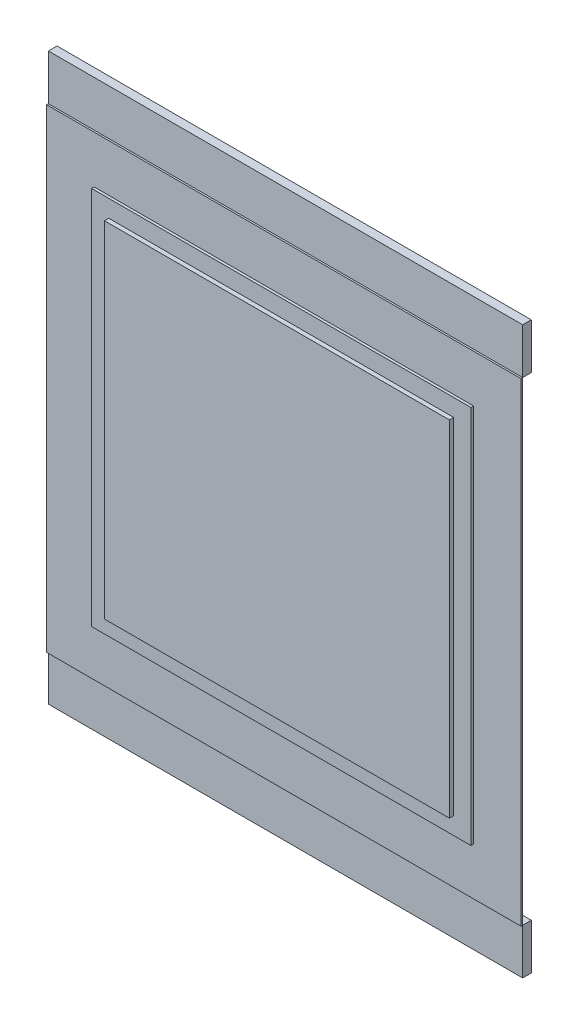
ISO-10303-21;
HEADER;
FILE_DESCRIPTION(('STEP AP214'),'2;1');
FILE_NAME('part.step','',(''),(''),'','','');
FILE_SCHEMA(('AUTOMOTIVE_DESIGN { 1 0 10303 214 1 1 1 1 }'));
ENDSEC;
DATA;
#1=APPLICATION_CONTEXT('core data for automotive mechanical design processes');
#2=APPLICATION_PROTOCOL_DEFINITION('international standard','automotive_design',2000,#1);
#3=PRODUCT_CONTEXT('',#1,'mechanical');
#4=PRODUCT('Part','Part','',(#3));
#5=PRODUCT_RELATED_PRODUCT_CATEGORY('part','',(#4));
#6=PRODUCT_DEFINITION_FORMATION('','',#4);
#7=PRODUCT_DEFINITION_CONTEXT('part definition',#1,'design');
#8=PRODUCT_DEFINITION('design','',#6,#7);
#9=PRODUCT_DEFINITION_SHAPE('','',#8);
#10=(LENGTH_UNIT() NAMED_UNIT(*) SI_UNIT(.MILLI.,.METRE.));
#11=(NAMED_UNIT(*) PLANE_ANGLE_UNIT() SI_UNIT($,.RADIAN.));
#12=(NAMED_UNIT(*) SI_UNIT($,.STERADIAN.) SOLID_ANGLE_UNIT());
#13=UNCERTAINTY_MEASURE_WITH_UNIT(LENGTH_MEASURE(1.E-05),#10,'distance_accuracy_value','');
#14=(GEOMETRIC_REPRESENTATION_CONTEXT(3) GLOBAL_UNCERTAINTY_ASSIGNED_CONTEXT((#13)) GLOBAL_UNIT_ASSIGNED_CONTEXT((#10,
#11,#12)) REPRESENTATION_CONTEXT('',''));
#15=CARTESIAN_POINT('',(0.,0.,0.));
#16=DIRECTION('',(0.,0.,1.));
#17=DIRECTION('',(1.,0.,0.));
#18=AXIS2_PLACEMENT_3D('',#15,#16,#17);
#19=CARTESIAN_POINT('',(-275.,275.,-10.));
#20=DIRECTION('',(1.,0.,0.));
#21=DIRECTION('',(0.,0.,-1.));
#22=AXIS2_PLACEMENT_3D('',#19,#20,#21);
#23=PLANE('',#22);
#24=DIRECTION('',(0.,1.,0.));
#25=VECTOR('',#24,1.);
#26=CARTESIAN_POINT('',(-275.,275.,0.));
#27=LINE('',#26,#25);
#28=CARTESIAN_POINT('',(-275.,275.,0.));
#29=VERTEX_POINT('',#28);
#30=CARTESIAN_POINT('',(-275.,328.,0.));
#31=VERTEX_POINT('',#30);
#32=EDGE_CURVE('E12',#29,#31,#27,.T.);
#33=ORIENTED_EDGE('',*,*,#32,.T.);
#34=DIRECTION('',(0.,0.,1.));
#35=VECTOR('',#34,1.);
#36=CARTESIAN_POINT('',(-275.,328.,-10.));
#37=LINE('',#36,#35);
#38=CARTESIAN_POINT('',(-275.,328.,-10.));
#39=VERTEX_POINT('',#38);
#40=EDGE_CURVE('E121',#39,#31,#37,.T.);
#41=ORIENTED_EDGE('',*,*,#40,.F.);
#42=DIRECTION('',(0.,1.,0.));
#43=VECTOR('',#42,1.);
#44=CARTESIAN_POINT('',(-275.,275.,-10.));
#45=LINE('',#44,#43);
#46=CARTESIAN_POINT('',(-275.,275.,-10.));
#47=VERTEX_POINT('',#46);
#48=EDGE_CURVE('E53',#47,#39,#45,.T.);
#49=ORIENTED_EDGE('',*,*,#48,.F.);
#50=DIRECTION('',(0.,0.,1.));
#51=VECTOR('',#50,1.);
#52=CARTESIAN_POINT('',(-275.,275.,-10.));
#53=LINE('',#52,#51);
#54=EDGE_CURVE('E108',#47,#29,#53,.T.);
#55=ORIENTED_EDGE('',*,*,#54,.T.);
#56=EDGE_LOOP('',(#33,#41,#49,#55));
#57=FACE_BOUND('',#56,.T.);
#58=ADVANCED_FACE('F49',(#57),#23,.F.);
#59=CARTESIAN_POINT('',(-275.,328.,-10.));
#60=DIRECTION('',(0.,-1.,0.));
#61=DIRECTION('',(0.,0.,-1.));
#62=AXIS2_PLACEMENT_3D('',#59,#60,#61);
#63=PLANE('',#62);
#64=DIRECTION('',(1.,0.,0.));
#65=VECTOR('',#64,1.);
#66=CARTESIAN_POINT('',(-275.,328.,0.));
#67=LINE('',#66,#65);
#68=CARTESIAN_POINT('',(275.,328.,0.));
#69=VERTEX_POINT('',#68);
#70=EDGE_CURVE('E58',#31,#69,#67,.T.);
#71=ORIENTED_EDGE('',*,*,#70,.T.);
#72=DIRECTION('',(0.,0.,1.));
#73=VECTOR('',#72,1.);
#74=CARTESIAN_POINT('',(275.,328.,-10.));
#75=LINE('',#74,#73);
#76=CARTESIAN_POINT('',(275.,328.,-10.));
#77=VERTEX_POINT('',#76);
#78=EDGE_CURVE('E104',#77,#69,#75,.T.);
#79=ORIENTED_EDGE('',*,*,#78,.F.);
#80=DIRECTION('',(1.,0.,0.));
#81=VECTOR('',#80,1.);
#82=CARTESIAN_POINT('',(-275.,328.,-10.));
#83=LINE('',#82,#81);
#84=EDGE_CURVE('E83',#39,#77,#83,.T.);
#85=ORIENTED_EDGE('',*,*,#84,.F.);
#86=ORIENTED_EDGE('',*,*,#40,.T.);
#87=EDGE_LOOP('',(#71,#79,#85,#86));
#88=FACE_BOUND('',#87,.T.);
#89=ADVANCED_FACE('F123',(#88),#63,.F.);
#90=CARTESIAN_POINT('',(275.,275.,-10.));
#91=DIRECTION('',(-1.,0.,0.));
#92=DIRECTION('',(0.,0.,1.));
#93=AXIS2_PLACEMENT_3D('',#90,#91,#92);
#94=PLANE('',#93);
#95=DIRECTION('',(0.,-1.,0.));
#96=VECTOR('',#95,1.);
#97=CARTESIAN_POINT('',(275.,275.,0.));
#98=LINE('',#97,#96);
#99=CARTESIAN_POINT('',(275.,275.,0.));
#100=VERTEX_POINT('',#99);
#101=EDGE_CURVE('E99',#69,#100,#98,.T.);
#102=ORIENTED_EDGE('',*,*,#101,.T.);
#103=DIRECTION('',(0.,0.,1.));
#104=VECTOR('',#103,1.);
#105=CARTESIAN_POINT('',(275.,275.,-10.));
#106=LINE('',#105,#104);
#107=CARTESIAN_POINT('',(275.,275.,-10.));
#108=VERTEX_POINT('',#107);
#109=EDGE_CURVE('E103',#108,#100,#106,.T.);
#110=ORIENTED_EDGE('',*,*,#109,.F.);
#111=DIRECTION('',(0.,-1.,0.));
#112=VECTOR('',#111,1.);
#113=CARTESIAN_POINT('',(275.,275.,-10.));
#114=LINE('',#113,#112);
#115=EDGE_CURVE('E120',#77,#108,#114,.T.);
#116=ORIENTED_EDGE('',*,*,#115,.F.);
#117=ORIENTED_EDGE('',*,*,#78,.T.);
#118=EDGE_LOOP('',(#102,#110,#116,#117));
#119=FACE_BOUND('',#118,.T.);
#120=ADVANCED_FACE('F101',(#119),#94,.F.);
#121=CARTESIAN_POINT('',(-275.,275.,-10.));
#122=DIRECTION('',(0.,1.,0.));
#123=DIRECTION('',(0.,0.,1.));
#124=AXIS2_PLACEMENT_3D('',#121,#122,#123);
#125=PLANE('',#124);
#126=DIRECTION('',(-1.,0.,0.));
#127=VECTOR('',#126,1.);
#128=CARTESIAN_POINT('',(-275.,275.,0.));
#129=LINE('',#128,#127);
#130=EDGE_CURVE('E94',#100,#29,#129,.T.);
#131=ORIENTED_EDGE('',*,*,#130,.T.);
#132=ORIENTED_EDGE('',*,*,#54,.F.);
#133=DIRECTION('',(-1.,0.,0.));
#134=VECTOR('',#133,1.);
#135=CARTESIAN_POINT('',(-275.,275.,-10.));
#136=LINE('',#135,#134);
#137=EDGE_CURVE('E107',#108,#47,#136,.T.);
#138=ORIENTED_EDGE('',*,*,#137,.F.);
#139=ORIENTED_EDGE('',*,*,#109,.T.);
#140=EDGE_LOOP('',(#131,#132,#138,#139));
#141=FACE_BOUND('',#140,.T.);
#142=ADVANCED_FACE('F110',(#141),#125,.F.);
#143=CARTESIAN_POINT('',(0.,0.,-10.));
#144=DIRECTION('',(0.,0.,-1.));
#145=DIRECTION('',(-1.,0.,0.));
#146=AXIS2_PLACEMENT_3D('',#143,#144,#145);
#147=PLANE('',#146);
#148=ORIENTED_EDGE('',*,*,#48,.T.);
#149=ORIENTED_EDGE('',*,*,#84,.T.);
#150=ORIENTED_EDGE('',*,*,#115,.T.);
#151=ORIENTED_EDGE('',*,*,#137,.T.);
#152=EDGE_LOOP('',(#148,#149,#150,#151));
#153=FACE_BOUND('',#152,.T.);
#154=ADVANCED_FACE('F55',(#153),#147,.T.);
#155=CARTESIAN_POINT('',(0.,0.,0.));
#156=DIRECTION('',(0.,0.,-1.));
#157=DIRECTION('',(-1.,0.,0.));
#158=AXIS2_PLACEMENT_3D('',#155,#156,#157);
#159=PLANE('',#158);
#160=ORIENTED_EDGE('',*,*,#32,.F.);
#161=ORIENTED_EDGE('',*,*,#130,.F.);
#162=ORIENTED_EDGE('',*,*,#101,.F.);
#163=ORIENTED_EDGE('',*,*,#70,.F.);
#164=EDGE_LOOP('',(#160,#161,#162,#163));
#165=FACE_BOUND('',#164,.T.);
#166=ADVANCED_FACE('F112',(#165),#159,.F.);
#167=CLOSED_SHELL('',(#58,#89,#120,#142,#154,#166));
#168=MANIFOLD_SOLID_BREP('B2',#167);
#169=CARTESIAN_POINT('',(-275.,-275.,-10.));
#170=DIRECTION('',(1.,0.,0.));
#171=DIRECTION('',(0.,0.,-1.));
#172=AXIS2_PLACEMENT_3D('',#169,#170,#171);
#173=PLANE('',#172);
#174=DIRECTION('',(0.,1.,0.));
#175=VECTOR('',#174,1.);
#176=CARTESIAN_POINT('',(-275.,-275.,0.));
#177=LINE('',#176,#175);
#178=CARTESIAN_POINT('',(-275.,-328.,0.));
#179=VERTEX_POINT('',#178);
#180=CARTESIAN_POINT('',(-275.,-275.,0.));
#181=VERTEX_POINT('',#180);
#182=EDGE_CURVE('E246',#179,#181,#177,.T.);
#183=ORIENTED_EDGE('',*,*,#182,.T.);
#184=DIRECTION('',(0.,0.,1.));
#185=VECTOR('',#184,1.);
#186=CARTESIAN_POINT('',(-275.,-275.,-10.));
#187=LINE('',#186,#185);
#188=CARTESIAN_POINT('',(-275.,-275.,-10.));
#189=VERTEX_POINT('',#188);
#190=EDGE_CURVE('E48',#189,#181,#187,.T.);
#191=ORIENTED_EDGE('',*,*,#190,.F.);
#192=DIRECTION('',(0.,1.,0.));
#193=VECTOR('',#192,1.);
#194=CARTESIAN_POINT('',(-275.,-275.,-10.));
#195=LINE('',#194,#193);
#196=CARTESIAN_POINT('',(-275.,-328.,-10.));
#197=VERTEX_POINT('',#196);
#198=EDGE_CURVE('E233',#197,#189,#195,.T.);
#199=ORIENTED_EDGE('',*,*,#198,.F.);
#200=DIRECTION('',(0.,0.,1.));
#201=VECTOR('',#200,1.);
#202=CARTESIAN_POINT('',(-275.,-328.,-10.));
#203=LINE('',#202,#201);
#204=EDGE_CURVE('E245',#197,#179,#203,.T.);
#205=ORIENTED_EDGE('',*,*,#204,.T.);
#206=EDGE_LOOP('',(#183,#191,#199,#205));
#207=FACE_BOUND('',#206,.T.);
#208=ADVANCED_FACE('F181',(#207),#173,.F.);
#209=CARTESIAN_POINT('',(-275.,-275.,-10.));
#210=DIRECTION('',(0.,-1.,0.));
#211=DIRECTION('',(0.,0.,-1.));
#212=AXIS2_PLACEMENT_3D('',#209,#210,#211);
#213=PLANE('',#212);
#214=DIRECTION('',(1.,0.,0.));
#215=VECTOR('',#214,1.);
#216=CARTESIAN_POINT('',(-275.,-275.,0.));
#217=LINE('',#216,#215);
#218=CARTESIAN_POINT('',(275.,-275.,0.));
#219=VERTEX_POINT('',#218);
#220=EDGE_CURVE('E236',#181,#219,#217,.T.);
#221=ORIENTED_EDGE('',*,*,#220,.T.);
#222=DIRECTION('',(0.,0.,1.));
#223=VECTOR('',#222,1.);
#224=CARTESIAN_POINT('',(275.,-275.,-10.));
#225=LINE('',#224,#223);
#226=CARTESIAN_POINT('',(275.,-275.,-10.));
#227=VERTEX_POINT('',#226);
#228=EDGE_CURVE('E191',#227,#219,#225,.T.);
#229=ORIENTED_EDGE('',*,*,#228,.F.);
#230=DIRECTION('',(1.,0.,0.));
#231=VECTOR('',#230,1.);
#232=CARTESIAN_POINT('',(-275.,-275.,-10.));
#233=LINE('',#232,#231);
#234=EDGE_CURVE('E226',#189,#227,#233,.T.);
#235=ORIENTED_EDGE('',*,*,#234,.F.);
#236=ORIENTED_EDGE('',*,*,#190,.T.);
#237=EDGE_LOOP('',(#221,#229,#235,#236));
#238=FACE_BOUND('',#237,.T.);
#239=ADVANCED_FACE('F240',(#238),#213,.F.);
#240=CARTESIAN_POINT('',(275.,-275.,-10.));
#241=DIRECTION('',(-1.,0.,0.));
#242=DIRECTION('',(0.,0.,1.));
#243=AXIS2_PLACEMENT_3D('',#240,#241,#242);
#244=PLANE('',#243);
#245=DIRECTION('',(0.,-1.,0.));
#246=VECTOR('',#245,1.);
#247=CARTESIAN_POINT('',(275.,-275.,0.));
#248=LINE('',#247,#246);
#249=CARTESIAN_POINT('',(275.,-328.,0.));
#250=VERTEX_POINT('',#249);
#251=EDGE_CURVE('E216',#219,#250,#248,.T.);
#252=ORIENTED_EDGE('',*,*,#251,.T.);
#253=DIRECTION('',(0.,0.,1.));
#254=VECTOR('',#253,1.);
#255=CARTESIAN_POINT('',(275.,-328.,-10.));
#256=LINE('',#255,#254);
#257=CARTESIAN_POINT('',(275.,-328.,-10.));
#258=VERTEX_POINT('',#257);
#259=EDGE_CURVE('E239',#258,#250,#256,.T.);
#260=ORIENTED_EDGE('',*,*,#259,.F.);
#261=DIRECTION('',(0.,-1.,0.));
#262=VECTOR('',#261,1.);
#263=CARTESIAN_POINT('',(275.,-275.,-10.));
#264=LINE('',#263,#262);
#265=EDGE_CURVE('E232',#227,#258,#264,.T.);
#266=ORIENTED_EDGE('',*,*,#265,.F.);
#267=ORIENTED_EDGE('',*,*,#228,.T.);
#268=EDGE_LOOP('',(#252,#260,#266,#267));
#269=FACE_BOUND('',#268,.T.);
#270=ADVANCED_FACE('F238',(#269),#244,.F.);
#271=CARTESIAN_POINT('',(-275.,-328.,-10.));
#272=DIRECTION('',(0.,1.,0.));
#273=DIRECTION('',(0.,0.,1.));
#274=AXIS2_PLACEMENT_3D('',#271,#272,#273);
#275=PLANE('',#274);
#276=DIRECTION('',(-1.,0.,0.));
#277=VECTOR('',#276,1.);
#278=CARTESIAN_POINT('',(-275.,-328.,0.));
#279=LINE('',#278,#277);
#280=EDGE_CURVE('E225',#250,#179,#279,.T.);
#281=ORIENTED_EDGE('',*,*,#280,.T.);
#282=ORIENTED_EDGE('',*,*,#204,.F.);
#283=DIRECTION('',(-1.,0.,0.));
#284=VECTOR('',#283,1.);
#285=CARTESIAN_POINT('',(-275.,-328.,-10.));
#286=LINE('',#285,#284);
#287=EDGE_CURVE('E200',#258,#197,#286,.T.);
#288=ORIENTED_EDGE('',*,*,#287,.F.);
#289=ORIENTED_EDGE('',*,*,#259,.T.);
#290=EDGE_LOOP('',(#281,#282,#288,#289));
#291=FACE_BOUND('',#290,.T.);
#292=ADVANCED_FACE('F251',(#291),#275,.F.);
#293=CARTESIAN_POINT('',(0.,0.,-10.));
#294=DIRECTION('',(0.,0.,1.));
#295=DIRECTION('',(1.,0.,0.));
#296=AXIS2_PLACEMENT_3D('',#293,#294,#295);
#297=PLANE('',#296);
#298=ORIENTED_EDGE('',*,*,#198,.T.);
#299=ORIENTED_EDGE('',*,*,#234,.T.);
#300=ORIENTED_EDGE('',*,*,#265,.T.);
#301=ORIENTED_EDGE('',*,*,#287,.T.);
#302=EDGE_LOOP('',(#298,#299,#300,#301));
#303=FACE_BOUND('',#302,.T.);
#304=ADVANCED_FACE('F228',(#303),#297,.F.);
#305=CARTESIAN_POINT('',(0.,0.,0.));
#306=DIRECTION('',(0.,0.,1.));
#307=DIRECTION('',(1.,0.,0.));
#308=AXIS2_PLACEMENT_3D('',#305,#306,#307);
#309=PLANE('',#308);
#310=ORIENTED_EDGE('',*,*,#182,.F.);
#311=ORIENTED_EDGE('',*,*,#280,.F.);
#312=ORIENTED_EDGE('',*,*,#251,.F.);
#313=ORIENTED_EDGE('',*,*,#220,.F.);
#314=EDGE_LOOP('',(#310,#311,#312,#313));
#315=FACE_BOUND('',#314,.T.);
#316=ADVANCED_FACE('F258',(#315),#309,.T.);
#317=CLOSED_SHELL('',(#208,#239,#270,#292,#304,#316));
#318=MANIFOLD_SOLID_BREP('B6',#317);
#319=CARTESIAN_POINT('',(-220.,-220.,5.));
#320=DIRECTION('',(-1.,0.,0.));
#321=DIRECTION('',(0.,0.,1.));
#322=AXIS2_PLACEMENT_3D('',#319,#320,#321);
#323=PLANE('',#322);
#324=DIRECTION('',(0.,0.,-1.));
#325=VECTOR('',#324,1.);
#326=CARTESIAN_POINT('',(-220.,220.,5.));
#327=LINE('',#326,#325);
#328=CARTESIAN_POINT('',(-220.,220.,5.));
#329=VERTEX_POINT('',#328);
#330=CARTESIAN_POINT('',(-220.,220.,2.));
#331=VERTEX_POINT('',#330);
#332=EDGE_CURVE('E457',#329,#331,#327,.T.);
#333=ORIENTED_EDGE('',*,*,#332,.T.);
#334=DIRECTION('',(0.,-1.,0.));
#335=VECTOR('',#334,1.);
#336=CARTESIAN_POINT('',(-220.,-220.,2.));
#337=LINE('',#336,#335);
#338=CARTESIAN_POINT('',(-220.,-220.,2.));
#339=VERTEX_POINT('',#338);
#340=EDGE_CURVE('E325',#331,#339,#337,.T.);
#341=ORIENTED_EDGE('',*,*,#340,.T.);
#342=DIRECTION('',(0.,0.,-1.));
#343=VECTOR('',#342,1.);
#344=CARTESIAN_POINT('',(-220.,-220.,5.));
#345=LINE('',#344,#343);
#346=CARTESIAN_POINT('',(-220.,-220.,5.));
#347=VERTEX_POINT('',#346);
#348=EDGE_CURVE('E460',#347,#339,#345,.T.);
#349=ORIENTED_EDGE('',*,*,#348,.F.);
#350=DIRECTION('',(0.,1.,0.));
#351=VECTOR('',#350,1.);
#352=CARTESIAN_POINT('',(-220.,-220.,5.));
#353=LINE('',#352,#351);
#354=EDGE_CURVE('E441',#347,#329,#353,.T.);
#355=ORIENTED_EDGE('',*,*,#354,.T.);
#356=EDGE_LOOP('',(#333,#341,#349,#355));
#357=FACE_BOUND('',#356,.T.);
#358=ADVANCED_FACE('F307',(#357),#323,.T.);
#359=CARTESIAN_POINT('',(-220.,-220.,5.));
#360=DIRECTION('',(0.,-1.,0.));
#361=DIRECTION('',(0.,0.,-1.));
#362=AXIS2_PLACEMENT_3D('',#359,#360,#361);
#363=PLANE('',#362);
#364=ORIENTED_EDGE('',*,*,#348,.T.);
#365=DIRECTION('',(1.,0.,0.));
#366=VECTOR('',#365,1.);
#367=CARTESIAN_POINT('',(-220.,-220.,2.));
#368=LINE('',#367,#366);
#369=CARTESIAN_POINT('',(220.,-220.,2.));
#370=VERTEX_POINT('',#369);
#371=EDGE_CURVE('E439',#339,#370,#368,.T.);
#372=ORIENTED_EDGE('',*,*,#371,.T.);
#373=DIRECTION('',(0.,0.,-1.));
#374=VECTOR('',#373,1.);
#375=CARTESIAN_POINT('',(220.,-220.,5.));
#376=LINE('',#375,#374);
#377=CARTESIAN_POINT('',(220.,-220.,5.));
#378=VERTEX_POINT('',#377);
#379=EDGE_CURVE('E462',#378,#370,#376,.T.);
#380=ORIENTED_EDGE('',*,*,#379,.F.);
#381=DIRECTION('',(-1.,0.,0.));
#382=VECTOR('',#381,1.);
#383=CARTESIAN_POINT('',(-220.,-220.,5.));
#384=LINE('',#383,#382);
#385=EDGE_CURVE('E454',#378,#347,#384,.T.);
#386=ORIENTED_EDGE('',*,*,#385,.T.);
#387=EDGE_LOOP('',(#364,#372,#380,#386));
#388=FACE_BOUND('',#387,.T.);
#389=ADVANCED_FACE('F518',(#388),#363,.T.);
#390=CARTESIAN_POINT('',(220.,-220.,5.));
#391=DIRECTION('',(1.,0.,0.));
#392=DIRECTION('',(0.,0.,-1.));
#393=AXIS2_PLACEMENT_3D('',#390,#391,#392);
#394=PLANE('',#393);
#395=ORIENTED_EDGE('',*,*,#379,.T.);
#396=DIRECTION('',(0.,1.,0.));
#397=VECTOR('',#396,1.);
#398=CARTESIAN_POINT('',(220.,-220.,2.));
#399=LINE('',#398,#397);
#400=CARTESIAN_POINT('',(220.,220.,2.));
#401=VERTEX_POINT('',#400);
#402=EDGE_CURVE('E432',#370,#401,#399,.T.);
#403=ORIENTED_EDGE('',*,*,#402,.T.);
#404=DIRECTION('',(0.,0.,-1.));
#405=VECTOR('',#404,1.);
#406=CARTESIAN_POINT('',(220.,220.,5.));
#407=LINE('',#406,#405);
#408=CARTESIAN_POINT('',(220.,220.,5.));
#409=VERTEX_POINT('',#408);
#410=EDGE_CURVE('E461',#409,#401,#407,.T.);
#411=ORIENTED_EDGE('',*,*,#410,.F.);
#412=DIRECTION('',(0.,-1.,0.));
#413=VECTOR('',#412,1.);
#414=CARTESIAN_POINT('',(220.,-220.,5.));
#415=LINE('',#414,#413);
#416=EDGE_CURVE('E448',#409,#378,#415,.T.);
#417=ORIENTED_EDGE('',*,*,#416,.T.);
#418=EDGE_LOOP('',(#395,#403,#411,#417));
#419=FACE_BOUND('',#418,.T.);
#420=ADVANCED_FACE('F527',(#419),#394,.T.);
#421=CARTESIAN_POINT('',(-220.,220.,5.));
#422=DIRECTION('',(0.,1.,0.));
#423=DIRECTION('',(0.,0.,1.));
#424=AXIS2_PLACEMENT_3D('',#421,#422,#423);
#425=PLANE('',#424);
#426=ORIENTED_EDGE('',*,*,#410,.T.);
#427=DIRECTION('',(-1.,0.,0.));
#428=VECTOR('',#427,1.);
#429=CARTESIAN_POINT('',(-220.,220.,2.));
#430=LINE('',#429,#428);
#431=EDGE_CURVE('E182',#401,#331,#430,.T.);
#432=ORIENTED_EDGE('',*,*,#431,.T.);
#433=ORIENTED_EDGE('',*,*,#332,.F.);
#434=DIRECTION('',(1.,0.,0.));
#435=VECTOR('',#434,1.);
#436=CARTESIAN_POINT('',(-220.,220.,5.));
#437=LINE('',#436,#435);
#438=EDGE_CURVE('E450',#329,#409,#437,.T.);
#439=ORIENTED_EDGE('',*,*,#438,.T.);
#440=EDGE_LOOP('',(#426,#432,#433,#439));
#441=FACE_BOUND('',#440,.T.);
#442=ADVANCED_FACE('F519',(#441),#425,.T.);
#443=CARTESIAN_POINT('',(-200.,0.,10.));
#444=DIRECTION('',(1.,0.,0.));
#445=DIRECTION('',(0.,1.,0.));
#446=AXIS2_PLACEMENT_3D('',#443,#444,#445);
#447=PLANE('',#446);
#448=DIRECTION('',(0.,1.,0.));
#449=VECTOR('',#448,1.);
#450=CARTESIAN_POINT('',(-200.,0.,5.));
#451=LINE('',#450,#449);
#452=CARTESIAN_POINT('',(-200.,-200.,5.));
#453=VERTEX_POINT('',#452);
#454=CARTESIAN_POINT('',(-200.,200.,5.));
#455=VERTEX_POINT('',#454);
#456=EDGE_CURVE('E328',#453,#455,#451,.T.);
#457=ORIENTED_EDGE('',*,*,#456,.F.);
#458=DIRECTION('',(0.,0.,-1.));
#459=VECTOR('',#458,1.);
#460=CARTESIAN_POINT('',(-200.,-200.,10.));
#461=LINE('',#460,#459);
#462=CARTESIAN_POINT('',(-200.,-200.,10.));
#463=VERTEX_POINT('',#462);
#464=EDGE_CURVE('E493',#463,#453,#461,.T.);
#465=ORIENTED_EDGE('',*,*,#464,.F.);
#466=DIRECTION('',(0.,-1.,0.));
#467=VECTOR('',#466,1.);
#468=CARTESIAN_POINT('',(-200.,0.,10.));
#469=LINE('',#468,#467);
#470=CARTESIAN_POINT('',(-200.,200.,10.));
#471=VERTEX_POINT('',#470);
#472=EDGE_CURVE('E475',#471,#463,#469,.T.);
#473=ORIENTED_EDGE('',*,*,#472,.F.);
#474=DIRECTION('',(0.,0.,-1.));
#475=VECTOR('',#474,1.);
#476=CARTESIAN_POINT('',(-200.,200.,10.));
#477=LINE('',#476,#475);
#478=EDGE_CURVE('E484',#471,#455,#477,.T.);
#479=ORIENTED_EDGE('',*,*,#478,.T.);
#480=EDGE_LOOP('',(#457,#465,#473,#479));
#481=FACE_BOUND('',#480,.T.);
#482=ADVANCED_FACE('F310',(#481),#447,.F.);
#483=CARTESIAN_POINT('',(0.,-200.,10.));
#484=DIRECTION('',(0.,1.,0.));
#485=DIRECTION('',(-1.,0.,0.));
#486=AXIS2_PLACEMENT_3D('',#483,#484,#485);
#487=PLANE('',#486);
#488=DIRECTION('',(-1.,0.,0.));
#489=VECTOR('',#488,1.);
#490=CARTESIAN_POINT('',(0.,-200.,5.));
#491=LINE('',#490,#489);
#492=CARTESIAN_POINT('',(200.,-200.,5.));
#493=VERTEX_POINT('',#492);
#494=EDGE_CURVE('E473',#493,#453,#491,.T.);
#495=ORIENTED_EDGE('',*,*,#494,.F.);
#496=DIRECTION('',(0.,0.,-1.));
#497=VECTOR('',#496,1.);
#498=CARTESIAN_POINT('',(200.,-200.,10.));
#499=LINE('',#498,#497);
#500=CARTESIAN_POINT('',(200.,-200.,10.));
#501=VERTEX_POINT('',#500);
#502=EDGE_CURVE('E491',#501,#493,#499,.T.);
#503=ORIENTED_EDGE('',*,*,#502,.F.);
#504=DIRECTION('',(1.,0.,0.));
#505=VECTOR('',#504,1.);
#506=CARTESIAN_POINT('',(0.,-200.,10.));
#507=LINE('',#506,#505);
#508=EDGE_CURVE('E480',#463,#501,#507,.T.);
#509=ORIENTED_EDGE('',*,*,#508,.F.);
#510=ORIENTED_EDGE('',*,*,#464,.T.);
#511=EDGE_LOOP('',(#495,#503,#509,#510));
#512=FACE_BOUND('',#511,.T.);
#513=ADVANCED_FACE('F512',(#512),#487,.F.);
#514=CARTESIAN_POINT('',(200.,0.,10.));
#515=DIRECTION('',(1.,0.,0.));
#516=DIRECTION('',(0.,1.,0.));
#517=AXIS2_PLACEMENT_3D('',#514,#515,#516);
#518=PLANE('',#517);
#519=ORIENTED_EDGE('',*,*,#502,.T.);
#520=DIRECTION('',(0.,1.,0.));
#521=VECTOR('',#520,1.);
#522=CARTESIAN_POINT('',(200.,0.,5.));
#523=LINE('',#522,#521);
#524=CARTESIAN_POINT('',(200.,200.,5.));
#525=VERTEX_POINT('',#524);
#526=EDGE_CURVE('E458',#493,#525,#523,.T.);
#527=ORIENTED_EDGE('',*,*,#526,.T.);
#528=DIRECTION('',(0.,0.,-1.));
#529=VECTOR('',#528,1.);
#530=CARTESIAN_POINT('',(200.,200.,10.));
#531=LINE('',#530,#529);
#532=CARTESIAN_POINT('',(200.,200.,10.));
#533=VERTEX_POINT('',#532);
#534=EDGE_CURVE('E488',#533,#525,#531,.T.);
#535=ORIENTED_EDGE('',*,*,#534,.F.);
#536=DIRECTION('',(0.,-1.,0.));
#537=VECTOR('',#536,1.);
#538=CARTESIAN_POINT('',(200.,0.,10.));
#539=LINE('',#538,#537);
#540=EDGE_CURVE('E479',#533,#501,#539,.T.);
#541=ORIENTED_EDGE('',*,*,#540,.T.);
#542=EDGE_LOOP('',(#519,#527,#535,#541));
#543=FACE_BOUND('',#542,.T.);
#544=ADVANCED_FACE('F507',(#543),#518,.T.);
#545=CARTESIAN_POINT('',(0.,200.,10.));
#546=DIRECTION('',(0.,1.,0.));
#547=DIRECTION('',(-1.,0.,0.));
#548=AXIS2_PLACEMENT_3D('',#545,#546,#547);
#549=PLANE('',#548);
#550=ORIENTED_EDGE('',*,*,#534,.T.);
#551=DIRECTION('',(-1.,0.,0.));
#552=VECTOR('',#551,1.);
#553=CARTESIAN_POINT('',(0.,200.,5.));
#554=LINE('',#553,#552);
#555=EDGE_CURVE('E312',#525,#455,#554,.T.);
#556=ORIENTED_EDGE('',*,*,#555,.T.);
#557=ORIENTED_EDGE('',*,*,#478,.F.);
#558=DIRECTION('',(1.,0.,0.));
#559=VECTOR('',#558,1.);
#560=CARTESIAN_POINT('',(0.,200.,10.));
#561=LINE('',#560,#559);
#562=EDGE_CURVE('E485',#471,#533,#561,.T.);
#563=ORIENTED_EDGE('',*,*,#562,.T.);
#564=EDGE_LOOP('',(#550,#556,#557,#563));
#565=FACE_BOUND('',#564,.T.);
#566=ADVANCED_FACE('F500',(#565),#549,.T.);
#567=CARTESIAN_POINT('',(0.,0.,10.));
#568=DIRECTION('',(0.,0.,1.));
#569=DIRECTION('',(1.,0.,0.));
#570=AXIS2_PLACEMENT_3D('',#567,#568,#569);
#571=PLANE('',#570);
#572=ORIENTED_EDGE('',*,*,#472,.T.);
#573=ORIENTED_EDGE('',*,*,#508,.T.);
#574=ORIENTED_EDGE('',*,*,#540,.F.);
#575=ORIENTED_EDGE('',*,*,#562,.F.);
#576=EDGE_LOOP('',(#572,#573,#574,#575));
#577=FACE_BOUND('',#576,.T.);
#578=ADVANCED_FACE('F501',(#577),#571,.T.);
#579=CARTESIAN_POINT('',(0.,0.,5.));
#580=DIRECTION('',(0.,0.,-1.));
#581=DIRECTION('',(-1.,0.,0.));
#582=AXIS2_PLACEMENT_3D('',#579,#580,#581);
#583=PLANE('',#582);
#584=ORIENTED_EDGE('',*,*,#354,.F.);
#585=ORIENTED_EDGE('',*,*,#385,.F.);
#586=ORIENTED_EDGE('',*,*,#416,.F.);
#587=ORIENTED_EDGE('',*,*,#438,.F.);
#588=EDGE_LOOP('',(#584,#585,#586,#587));
#589=FACE_BOUND('',#588,.T.);
#590=ORIENTED_EDGE('',*,*,#494,.T.);
#591=ORIENTED_EDGE('',*,*,#456,.T.);
#592=ORIENTED_EDGE('',*,*,#555,.F.);
#593=ORIENTED_EDGE('',*,*,#526,.F.);
#594=EDGE_LOOP('',(#590,#591,#592,#593));
#595=FACE_BOUND('',#594,.T.);
#596=ADVANCED_FACE('F508',(#589,#595),#583,.F.);
#597=CARTESIAN_POINT('',(-275.,-275.,2.));
#598=DIRECTION('',(-1.,0.,0.));
#599=DIRECTION('',(0.,0.,1.));
#600=AXIS2_PLACEMENT_3D('',#597,#598,#599);
#601=PLANE('',#600);
#602=DIRECTION('',(0.,1.,0.));
#603=VECTOR('',#602,1.);
#604=CARTESIAN_POINT('',(-275.,-275.,0.));
#605=LINE('',#604,#603);
#606=CARTESIAN_POINT('',(-275.,-275.,0.));
#607=VERTEX_POINT('',#606);
#608=CARTESIAN_POINT('',(-275.,275.,0.));
#609=VERTEX_POINT('',#608);
#610=EDGE_CURVE('E428',#607,#609,#605,.T.);
#611=ORIENTED_EDGE('',*,*,#610,.F.);
#612=DIRECTION('',(0.,0.,-1.));
#613=VECTOR('',#612,1.);
#614=CARTESIAN_POINT('',(-275.,-275.,2.));
#615=LINE('',#614,#613);
#616=CARTESIAN_POINT('',(-275.,-275.,2.));
#617=VERTEX_POINT('',#616);
#618=EDGE_CURVE('E420',#617,#607,#615,.T.);
#619=ORIENTED_EDGE('',*,*,#618,.F.);
#620=DIRECTION('',(0.,1.,0.));
#621=VECTOR('',#620,1.);
#622=CARTESIAN_POINT('',(-275.,-275.,2.));
#623=LINE('',#622,#621);
#624=CARTESIAN_POINT('',(-275.,275.,2.));
#625=VERTEX_POINT('',#624);
#626=EDGE_CURVE('E414',#617,#625,#623,.T.);
#627=ORIENTED_EDGE('',*,*,#626,.T.);
#628=DIRECTION('',(0.,0.,-1.));
#629=VECTOR('',#628,1.);
#630=CARTESIAN_POINT('',(-275.,275.,2.));
#631=LINE('',#630,#629);
#632=EDGE_CURVE('E393',#625,#609,#631,.T.);
#633=ORIENTED_EDGE('',*,*,#632,.T.);
#634=EDGE_LOOP('',(#611,#619,#627,#633));
#635=FACE_BOUND('',#634,.T.);
#636=ADVANCED_FACE('F416',(#635),#601,.T.);
#637=CARTESIAN_POINT('',(-275.,-275.,2.));
#638=DIRECTION('',(0.,-1.,0.));
#639=DIRECTION('',(0.,0.,-1.));
#640=AXIS2_PLACEMENT_3D('',#637,#638,#639);
#641=PLANE('',#640);
#642=DIRECTION('',(-1.,0.,0.));
#643=VECTOR('',#642,1.);
#644=CARTESIAN_POINT('',(-275.,-275.,0.));
#645=LINE('',#644,#643);
#646=CARTESIAN_POINT('',(275.,-275.,0.));
#647=VERTEX_POINT('',#646);
#648=EDGE_CURVE('E419',#647,#607,#645,.T.);
#649=ORIENTED_EDGE('',*,*,#648,.F.);
#650=DIRECTION('',(0.,0.,-1.));
#651=VECTOR('',#650,1.);
#652=CARTESIAN_POINT('',(275.,-275.,2.));
#653=LINE('',#652,#651);
#654=CARTESIAN_POINT('',(275.,-275.,2.));
#655=VERTEX_POINT('',#654);
#656=EDGE_CURVE('E434',#655,#647,#653,.T.);
#657=ORIENTED_EDGE('',*,*,#656,.F.);
#658=DIRECTION('',(-1.,0.,0.));
#659=VECTOR('',#658,1.);
#660=CARTESIAN_POINT('',(-275.,-275.,2.));
#661=LINE('',#660,#659);
#662=EDGE_CURVE('E407',#655,#617,#661,.T.);
#663=ORIENTED_EDGE('',*,*,#662,.T.);
#664=ORIENTED_EDGE('',*,*,#618,.T.);
#665=EDGE_LOOP('',(#649,#657,#663,#664));
#666=FACE_BOUND('',#665,.T.);
#667=ADVANCED_FACE('F599',(#666),#641,.T.);
#668=CARTESIAN_POINT('',(275.,-275.,2.));
#669=DIRECTION('',(1.,0.,0.));
#670=DIRECTION('',(0.,0.,-1.));
#671=AXIS2_PLACEMENT_3D('',#668,#669,#670);
#672=PLANE('',#671);
#673=DIRECTION('',(0.,-1.,0.));
#674=VECTOR('',#673,1.);
#675=CARTESIAN_POINT('',(275.,-275.,0.));
#676=LINE('',#675,#674);
#677=CARTESIAN_POINT('',(275.,275.,0.));
#678=VERTEX_POINT('',#677);
#679=EDGE_CURVE('E421',#678,#647,#676,.T.);
#680=ORIENTED_EDGE('',*,*,#679,.F.);
#681=DIRECTION('',(0.,0.,-1.));
#682=VECTOR('',#681,1.);
#683=CARTESIAN_POINT('',(275.,275.,2.));
#684=LINE('',#683,#682);
#685=CARTESIAN_POINT('',(275.,275.,2.));
#686=VERTEX_POINT('',#685);
#687=EDGE_CURVE('E403',#686,#678,#684,.T.);
#688=ORIENTED_EDGE('',*,*,#687,.F.);
#689=DIRECTION('',(0.,-1.,0.));
#690=VECTOR('',#689,1.);
#691=CARTESIAN_POINT('',(275.,-275.,2.));
#692=LINE('',#691,#690);
#693=EDGE_CURVE('E418',#686,#655,#692,.T.);
#694=ORIENTED_EDGE('',*,*,#693,.T.);
#695=ORIENTED_EDGE('',*,*,#656,.T.);
#696=EDGE_LOOP('',(#680,#688,#694,#695));
#697=FACE_BOUND('',#696,.T.);
#698=ADVANCED_FACE('F606',(#697),#672,.T.);
#699=CARTESIAN_POINT('',(-275.,275.,2.));
#700=DIRECTION('',(0.,1.,0.));
#701=DIRECTION('',(0.,0.,1.));
#702=AXIS2_PLACEMENT_3D('',#699,#700,#701);
#703=PLANE('',#702);
#704=DIRECTION('',(1.,0.,0.));
#705=VECTOR('',#704,1.);
#706=CARTESIAN_POINT('',(-275.,275.,0.));
#707=LINE('',#706,#705);
#708=EDGE_CURVE('E400',#609,#678,#707,.T.);
#709=ORIENTED_EDGE('',*,*,#708,.F.);
#710=ORIENTED_EDGE('',*,*,#632,.F.);
#711=DIRECTION('',(1.,0.,0.));
#712=VECTOR('',#711,1.);
#713=CARTESIAN_POINT('',(-275.,275.,2.));
#714=LINE('',#713,#712);
#715=EDGE_CURVE('E399',#625,#686,#714,.T.);
#716=ORIENTED_EDGE('',*,*,#715,.T.);
#717=ORIENTED_EDGE('',*,*,#687,.T.);
#718=EDGE_LOOP('',(#709,#710,#716,#717));
#719=FACE_BOUND('',#718,.T.);
#720=ADVANCED_FACE('F397',(#719),#703,.T.);
#721=CARTESIAN_POINT('',(0.,0.,2.));
#722=DIRECTION('',(0.,0.,-1.));
#723=DIRECTION('',(-1.,0.,0.));
#724=AXIS2_PLACEMENT_3D('',#721,#722,#723);
#725=PLANE('',#724);
#726=ORIENTED_EDGE('',*,*,#340,.F.);
#727=ORIENTED_EDGE('',*,*,#431,.F.);
#728=ORIENTED_EDGE('',*,*,#402,.F.);
#729=ORIENTED_EDGE('',*,*,#371,.F.);
#730=EDGE_LOOP('',(#726,#727,#728,#729));
#731=FACE_BOUND('',#730,.T.);
#732=ORIENTED_EDGE('',*,*,#626,.F.);
#733=ORIENTED_EDGE('',*,*,#662,.F.);
#734=ORIENTED_EDGE('',*,*,#693,.F.);
#735=ORIENTED_EDGE('',*,*,#715,.F.);
#736=EDGE_LOOP('',(#732,#733,#734,#735));
#737=FACE_BOUND('',#736,.T.);
#738=ADVANCED_FACE('F411',(#731,#737),#725,.F.);
#739=CARTESIAN_POINT('',(0.,0.,0.));
#740=DIRECTION('',(0.,0.,1.));
#741=DIRECTION('',(1.,0.,0.));
#742=AXIS2_PLACEMENT_3D('',#739,#740,#741);
#743=PLANE('',#742);
#744=ORIENTED_EDGE('',*,*,#610,.T.);
#745=ORIENTED_EDGE('',*,*,#708,.T.);
#746=ORIENTED_EDGE('',*,*,#679,.T.);
#747=ORIENTED_EDGE('',*,*,#648,.T.);
#748=EDGE_LOOP('',(#744,#745,#746,#747));
#749=FACE_BOUND('',#748,.T.);
#750=ADVANCED_FACE('F532',(#749),#743,.F.);
#751=CLOSED_SHELL('',(#358,#389,#420,#442,#482,#513,#544,#566,#578,#596,#636,#667,#698,#720,
#738,#750));
#752=MANIFOLD_SOLID_BREP('B45',#751);
#753=ADVANCED_BREP_SHAPE_REPRESENTATION('',(#18,#168,#318,#752),#14);
#754=SHAPE_DEFINITION_REPRESENTATION(#9,#753);
ENDSEC;
END-ISO-10303-21;
